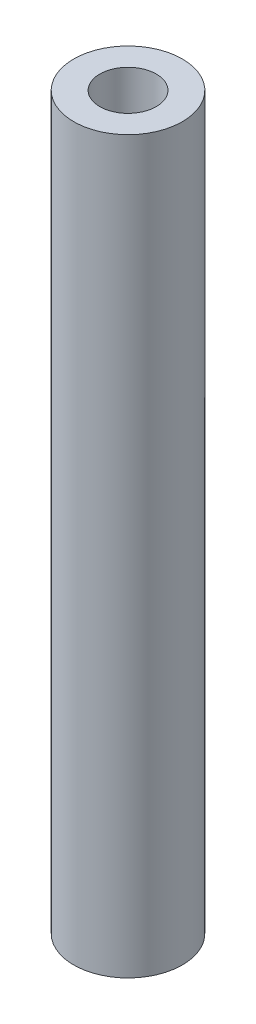
ISO-10303-21;
HEADER;
FILE_DESCRIPTION(('STEP AP214'),'2;1');
FILE_NAME('part.step','',(''),(''),'','','');
FILE_SCHEMA(('AUTOMOTIVE_DESIGN { 1 0 10303 214 1 1 1 1 }'));
ENDSEC;
DATA;
#1=APPLICATION_CONTEXT('core data for automotive mechanical design processes');
#2=APPLICATION_PROTOCOL_DEFINITION('international standard','automotive_design',2000,#1);
#3=PRODUCT_CONTEXT('',#1,'mechanical');
#4=PRODUCT('Part','Part','',(#3));
#5=PRODUCT_RELATED_PRODUCT_CATEGORY('part','',(#4));
#6=PRODUCT_DEFINITION_FORMATION('','',#4);
#7=PRODUCT_DEFINITION_CONTEXT('part definition',#1,'design');
#8=PRODUCT_DEFINITION('design','',#6,#7);
#9=PRODUCT_DEFINITION_SHAPE('','',#8);
#10=(LENGTH_UNIT() NAMED_UNIT(*) SI_UNIT(.MILLI.,.METRE.));
#11=(NAMED_UNIT(*) PLANE_ANGLE_UNIT() SI_UNIT($,.RADIAN.));
#12=(NAMED_UNIT(*) SI_UNIT($,.STERADIAN.) SOLID_ANGLE_UNIT());
#13=UNCERTAINTY_MEASURE_WITH_UNIT(LENGTH_MEASURE(1.E-05),#10,'distance_accuracy_value','');
#14=(GEOMETRIC_REPRESENTATION_CONTEXT(3) GLOBAL_UNCERTAINTY_ASSIGNED_CONTEXT((#13)) GLOBAL_UNIT_ASSIGNED_CONTEXT((#10,
#11,#12)) REPRESENTATION_CONTEXT('',''));
#15=CARTESIAN_POINT('',(0.,0.,0.));
#16=DIRECTION('',(0.,0.,1.));
#17=DIRECTION('',(1.,0.,0.));
#18=AXIS2_PLACEMENT_3D('',#15,#16,#17);
#19=CARTESIAN_POINT('',(0.,171.679934762336,0.));
#20=DIRECTION('',(0.,-1.,0.));
#21=DIRECTION('',(0.,0.,-1.));
#22=AXIS2_PLACEMENT_3D('',#19,#20,#21);
#23=CYLINDRICAL_SURFACE('',#22,6.5);
#24=CARTESIAN_POINT('',(0.,168.,0.));
#25=DIRECTION('',(0.,-1.,0.));
#26=DIRECTION('',(0.,0.,-1.));
#27=AXIS2_PLACEMENT_3D('',#24,#25,#26);
#28=CIRCLE('',#27,6.5);
#29=CARTESIAN_POINT('',(0.,168.,-6.5));
#30=VERTEX_POINT('',#29);
#31=EDGE_CURVE('E16',#30,#30,#28,.T.);
#32=ORIENTED_EDGE('',*,*,#31,.F.);
#33=EDGE_LOOP('',(#32));
#34=FACE_BOUND('',#33,.T.);
#35=CARTESIAN_POINT('',(0.,0.,0.));
#36=DIRECTION('',(0.,-1.,0.));
#37=DIRECTION('',(0.,0.,-1.));
#38=AXIS2_PLACEMENT_3D('',#35,#36,#37);
#39=CIRCLE('',#38,6.5);
#40=CARTESIAN_POINT('',(0.,0.,-6.5));
#41=VERTEX_POINT('',#40);
#42=EDGE_CURVE('E25',#41,#41,#39,.T.);
#43=ORIENTED_EDGE('',*,*,#42,.T.);
#44=EDGE_LOOP('',(#43));
#45=FACE_BOUND('',#44,.T.);
#46=ADVANCED_FACE('F13',(#34,#45),#23,.F.);
#47=CARTESIAN_POINT('',(0.,168.,0.));
#48=DIRECTION('',(0.,1.,0.));
#49=DIRECTION('',(0.,0.,1.));
#50=AXIS2_PLACEMENT_3D('',#47,#48,#49);
#51=PLANE('',#50);
#52=CARTESIAN_POINT('',(0.,168.,0.));
#53=DIRECTION('',(0.,-1.,0.));
#54=DIRECTION('',(0.,0.,-1.));
#55=AXIS2_PLACEMENT_3D('',#52,#53,#54);
#56=CIRCLE('',#55,12.5);
#57=CARTESIAN_POINT('',(0.,168.,-12.5));
#58=VERTEX_POINT('',#57);
#59=EDGE_CURVE('E20',#58,#58,#56,.T.);
#60=ORIENTED_EDGE('',*,*,#59,.F.);
#61=EDGE_LOOP('',(#60));
#62=FACE_BOUND('',#61,.T.);
#63=ORIENTED_EDGE('',*,*,#31,.T.);
#64=EDGE_LOOP('',(#63));
#65=FACE_BOUND('',#64,.T.);
#66=ADVANCED_FACE('F33',(#62,#65),#51,.T.);
#67=CARTESIAN_POINT('',(0.,0.,0.));
#68=DIRECTION('',(0.,1.,0.));
#69=DIRECTION('',(0.,0.,1.));
#70=AXIS2_PLACEMENT_3D('',#67,#68,#69);
#71=PLANE('',#70);
#72=CARTESIAN_POINT('',(0.,0.,0.));
#73=DIRECTION('',(0.,-1.,0.));
#74=DIRECTION('',(0.,0.,-1.));
#75=AXIS2_PLACEMENT_3D('',#72,#73,#74);
#76=CIRCLE('',#75,12.5);
#77=CARTESIAN_POINT('',(0.,0.,-12.5));
#78=VERTEX_POINT('',#77);
#79=EDGE_CURVE('E9',#78,#78,#76,.F.);
#80=ORIENTED_EDGE('',*,*,#79,.F.);
#81=EDGE_LOOP('',(#80));
#82=FACE_BOUND('',#81,.T.);
#83=ORIENTED_EDGE('',*,*,#42,.F.);
#84=EDGE_LOOP('',(#83));
#85=FACE_BOUND('',#84,.T.);
#86=ADVANCED_FACE('F40',(#82,#85),#71,.F.);
#87=CARTESIAN_POINT('',(0.,168.,0.));
#88=DIRECTION('',(0.,-1.,0.));
#89=DIRECTION('',(0.,0.,-1.));
#90=AXIS2_PLACEMENT_3D('',#87,#88,#89);
#91=CYLINDRICAL_SURFACE('',#90,12.5);
#92=ORIENTED_EDGE('',*,*,#79,.T.);
#93=EDGE_LOOP('',(#92));
#94=FACE_BOUND('',#93,.T.);
#95=ORIENTED_EDGE('',*,*,#59,.T.);
#96=EDGE_LOOP('',(#95));
#97=FACE_BOUND('',#96,.T.);
#98=ADVANCED_FACE('F42',(#94,#97),#91,.T.);
#99=CLOSED_SHELL('',(#46,#66,#86,#98));
#100=MANIFOLD_SOLID_BREP('B1',#99);
#101=ADVANCED_BREP_SHAPE_REPRESENTATION('',(#18,#100),#14);
#102=SHAPE_DEFINITION_REPRESENTATION(#9,#101);
ENDSEC;
END-ISO-10303-21;
